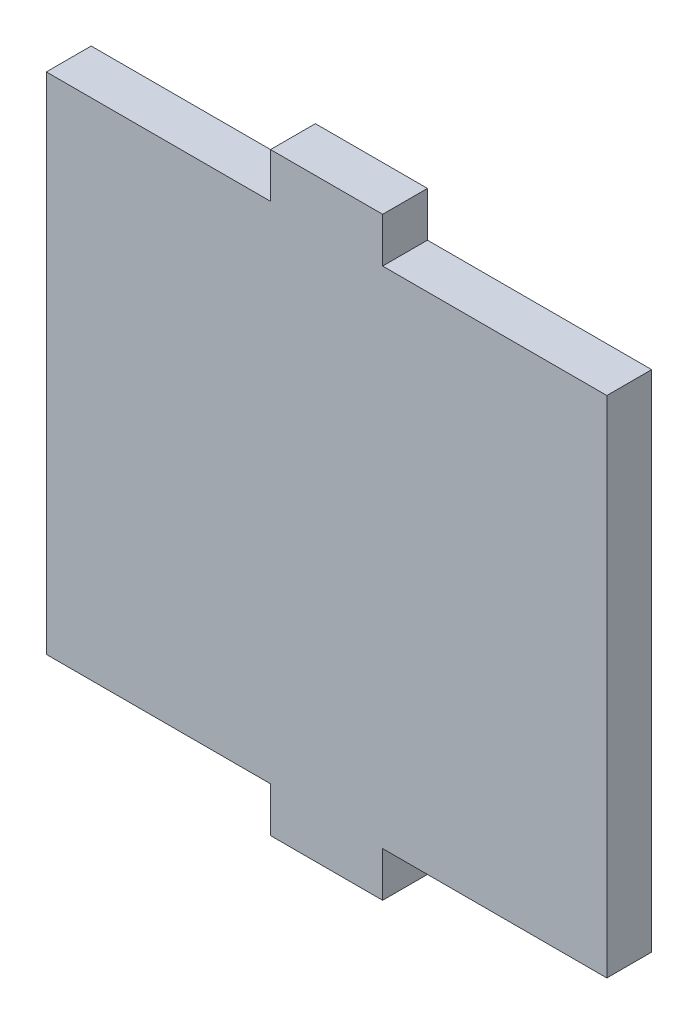
ISO-10303-21;
HEADER;
FILE_DESCRIPTION(('STEP AP214'),'2;1');
FILE_NAME('part.step','',(''),(''),'','','');
FILE_SCHEMA(('AUTOMOTIVE_DESIGN { 1 0 10303 214 1 1 1 1 }'));
ENDSEC;
DATA;
#1=APPLICATION_CONTEXT('core data for automotive mechanical design processes');
#2=APPLICATION_PROTOCOL_DEFINITION('international standard','automotive_design',2000,#1);
#3=PRODUCT_CONTEXT('',#1,'mechanical');
#4=PRODUCT('Part','Part','',(#3));
#5=PRODUCT_RELATED_PRODUCT_CATEGORY('part','',(#4));
#6=PRODUCT_DEFINITION_FORMATION('','',#4);
#7=PRODUCT_DEFINITION_CONTEXT('part definition',#1,'design');
#8=PRODUCT_DEFINITION('design','',#6,#7);
#9=PRODUCT_DEFINITION_SHAPE('','',#8);
#10=(LENGTH_UNIT() NAMED_UNIT(*) SI_UNIT(.MILLI.,.METRE.));
#11=(NAMED_UNIT(*) PLANE_ANGLE_UNIT() SI_UNIT($,.RADIAN.));
#12=(NAMED_UNIT(*) SI_UNIT($,.STERADIAN.) SOLID_ANGLE_UNIT());
#13=UNCERTAINTY_MEASURE_WITH_UNIT(LENGTH_MEASURE(1.E-05),#10,'distance_accuracy_value','');
#14=(GEOMETRIC_REPRESENTATION_CONTEXT(3) GLOBAL_UNCERTAINTY_ASSIGNED_CONTEXT((#13)) GLOBAL_UNIT_ASSIGNED_CONTEXT((#10,
#11,#12)) REPRESENTATION_CONTEXT('',''));
#15=CARTESIAN_POINT('',(0.,0.,0.));
#16=DIRECTION('',(0.,0.,1.));
#17=DIRECTION('',(1.,0.,0.));
#18=AXIS2_PLACEMENT_3D('',#15,#16,#17);
#19=CARTESIAN_POINT('',(0.,0.,4.));
#20=DIRECTION('',(0.,-1.,0.));
#21=DIRECTION('',(0.,0.,-1.));
#22=AXIS2_PLACEMENT_3D('',#19,#20,#21);
#23=PLANE('',#22);
#24=DIRECTION('',(-1.,0.,0.));
#25=VECTOR('',#24,1.);
#26=CARTESIAN_POINT('',(0.,0.,0.));
#27=LINE('',#26,#25);
#28=CARTESIAN_POINT('',(20.,0.,0.));
#29=VERTEX_POINT('',#28);
#30=CARTESIAN_POINT('',(0.,0.,0.));
#31=VERTEX_POINT('',#30);
#32=EDGE_CURVE('E164',#29,#31,#27,.T.);
#33=ORIENTED_EDGE('',*,*,#32,.T.);
#34=DIRECTION('',(0.,0.,-1.));
#35=VECTOR('',#34,1.);
#36=CARTESIAN_POINT('',(0.,0.,4.));
#37=LINE('',#36,#35);
#38=CARTESIAN_POINT('',(0.,0.,4.));
#39=VERTEX_POINT('',#38);
#40=EDGE_CURVE('E11',#39,#31,#37,.T.);
#41=ORIENTED_EDGE('',*,*,#40,.F.);
#42=DIRECTION('',(-1.,0.,0.));
#43=VECTOR('',#42,1.);
#44=CARTESIAN_POINT('',(0.,0.,4.));
#45=LINE('',#44,#43);
#46=CARTESIAN_POINT('',(20.,0.,4.));
#47=VERTEX_POINT('',#46);
#48=EDGE_CURVE('E198',#47,#39,#45,.T.);
#49=ORIENTED_EDGE('',*,*,#48,.F.);
#50=DIRECTION('',(0.,0.,-1.));
#51=VECTOR('',#50,1.);
#52=CARTESIAN_POINT('',(20.,0.,4.));
#53=LINE('',#52,#51);
#54=EDGE_CURVE('E160',#47,#29,#53,.T.);
#55=ORIENTED_EDGE('',*,*,#54,.T.);
#56=EDGE_LOOP('',(#33,#41,#49,#55));
#57=FACE_BOUND('',#56,.T.);
#58=ADVANCED_FACE('F39',(#57),#23,.F.);
#59=CARTESIAN_POINT('',(0.,-45.,4.));
#60=DIRECTION('',(1.,0.,0.));
#61=DIRECTION('',(0.,0.,-1.));
#62=AXIS2_PLACEMENT_3D('',#59,#60,#61);
#63=PLANE('',#62);
#64=DIRECTION('',(0.,-1.,0.));
#65=VECTOR('',#64,1.);
#66=CARTESIAN_POINT('',(0.,-45.,0.));
#67=LINE('',#66,#65);
#68=CARTESIAN_POINT('',(0.,-45.,0.));
#69=VERTEX_POINT('',#68);
#70=EDGE_CURVE('E168',#31,#69,#67,.T.);
#71=ORIENTED_EDGE('',*,*,#70,.T.);
#72=DIRECTION('',(0.,0.,-1.));
#73=VECTOR('',#72,1.);
#74=CARTESIAN_POINT('',(0.,-45.,4.));
#75=LINE('',#74,#73);
#76=CARTESIAN_POINT('',(0.,-45.,4.));
#77=VERTEX_POINT('',#76);
#78=EDGE_CURVE('E48',#77,#69,#75,.T.);
#79=ORIENTED_EDGE('',*,*,#78,.F.);
#80=DIRECTION('',(0.,-1.,0.));
#81=VECTOR('',#80,1.);
#82=CARTESIAN_POINT('',(0.,-45.,4.));
#83=LINE('',#82,#81);
#84=EDGE_CURVE('E111',#39,#77,#83,.T.);
#85=ORIENTED_EDGE('',*,*,#84,.F.);
#86=ORIENTED_EDGE('',*,*,#40,.T.);
#87=EDGE_LOOP('',(#71,#79,#85,#86));
#88=FACE_BOUND('',#87,.T.);
#89=ADVANCED_FACE('F292',(#88),#63,.F.);
#90=CARTESIAN_POINT('',(20.,-45.,4.));
#91=DIRECTION('',(0.,1.,0.));
#92=DIRECTION('',(0.,0.,1.));
#93=AXIS2_PLACEMENT_3D('',#90,#91,#92);
#94=PLANE('',#93);
#95=DIRECTION('',(1.,0.,0.));
#96=VECTOR('',#95,1.);
#97=CARTESIAN_POINT('',(20.,-45.,0.));
#98=LINE('',#97,#96);
#99=CARTESIAN_POINT('',(20.,-45.,0.));
#100=VERTEX_POINT('',#99);
#101=EDGE_CURVE('E171',#69,#100,#98,.T.);
#102=ORIENTED_EDGE('',*,*,#101,.T.);
#103=DIRECTION('',(0.,0.,-1.));
#104=VECTOR('',#103,1.);
#105=CARTESIAN_POINT('',(20.,-45.,4.));
#106=LINE('',#105,#104);
#107=CARTESIAN_POINT('',(20.,-45.,4.));
#108=VERTEX_POINT('',#107);
#109=EDGE_CURVE('E225',#108,#100,#106,.T.);
#110=ORIENTED_EDGE('',*,*,#109,.F.);
#111=DIRECTION('',(1.,0.,0.));
#112=VECTOR('',#111,1.);
#113=CARTESIAN_POINT('',(20.,-45.,4.));
#114=LINE('',#113,#112);
#115=EDGE_CURVE('E235',#77,#108,#114,.T.);
#116=ORIENTED_EDGE('',*,*,#115,.F.);
#117=ORIENTED_EDGE('',*,*,#78,.T.);
#118=EDGE_LOOP('',(#102,#110,#116,#117));
#119=FACE_BOUND('',#118,.T.);
#120=ADVANCED_FACE('F233',(#119),#94,.F.);
#121=CARTESIAN_POINT('',(20.,-49.,4.));
#122=DIRECTION('',(1.,0.,0.));
#123=DIRECTION('',(0.,0.,-1.));
#124=AXIS2_PLACEMENT_3D('',#121,#122,#123);
#125=PLANE('',#124);
#126=DIRECTION('',(0.,-1.,0.));
#127=VECTOR('',#126,1.);
#128=CARTESIAN_POINT('',(20.,-49.,0.));
#129=LINE('',#128,#127);
#130=CARTESIAN_POINT('',(20.,-49.,0.));
#131=VERTEX_POINT('',#130);
#132=EDGE_CURVE('E174',#100,#131,#129,.T.);
#133=ORIENTED_EDGE('',*,*,#132,.T.);
#134=DIRECTION('',(0.,0.,-1.));
#135=VECTOR('',#134,1.);
#136=CARTESIAN_POINT('',(20.,-49.,4.));
#137=LINE('',#136,#135);
#138=CARTESIAN_POINT('',(20.,-49.,4.));
#139=VERTEX_POINT('',#138);
#140=EDGE_CURVE('E221',#139,#131,#137,.T.);
#141=ORIENTED_EDGE('',*,*,#140,.F.);
#142=DIRECTION('',(0.,-1.,0.));
#143=VECTOR('',#142,1.);
#144=CARTESIAN_POINT('',(20.,-49.,4.));
#145=LINE('',#144,#143);
#146=EDGE_CURVE('E254',#108,#139,#145,.T.);
#147=ORIENTED_EDGE('',*,*,#146,.F.);
#148=ORIENTED_EDGE('',*,*,#109,.T.);
#149=EDGE_LOOP('',(#133,#141,#147,#148));
#150=FACE_BOUND('',#149,.T.);
#151=ADVANCED_FACE('F244',(#150),#125,.F.);
#152=CARTESIAN_POINT('',(30.,-49.,4.));
#153=DIRECTION('',(0.,1.,0.));
#154=DIRECTION('',(0.,0.,1.));
#155=AXIS2_PLACEMENT_3D('',#152,#153,#154);
#156=PLANE('',#155);
#157=DIRECTION('',(1.,0.,0.));
#158=VECTOR('',#157,1.);
#159=CARTESIAN_POINT('',(30.,-49.,0.));
#160=LINE('',#159,#158);
#161=CARTESIAN_POINT('',(30.,-49.,0.));
#162=VERTEX_POINT('',#161);
#163=EDGE_CURVE('E177',#131,#162,#160,.T.);
#164=ORIENTED_EDGE('',*,*,#163,.T.);
#165=DIRECTION('',(0.,0.,-1.));
#166=VECTOR('',#165,1.);
#167=CARTESIAN_POINT('',(30.,-49.,4.));
#168=LINE('',#167,#166);
#169=CARTESIAN_POINT('',(30.,-49.,4.));
#170=VERTEX_POINT('',#169);
#171=EDGE_CURVE('E217',#170,#162,#168,.T.);
#172=ORIENTED_EDGE('',*,*,#171,.F.);
#173=DIRECTION('',(1.,0.,0.));
#174=VECTOR('',#173,1.);
#175=CARTESIAN_POINT('',(30.,-49.,4.));
#176=LINE('',#175,#174);
#177=EDGE_CURVE('E250',#139,#170,#176,.T.);
#178=ORIENTED_EDGE('',*,*,#177,.F.);
#179=ORIENTED_EDGE('',*,*,#140,.T.);
#180=EDGE_LOOP('',(#164,#172,#178,#179));
#181=FACE_BOUND('',#180,.T.);
#182=ADVANCED_FACE('F248',(#181),#156,.F.);
#183=CARTESIAN_POINT('',(30.,-45.,4.));
#184=DIRECTION('',(-1.,0.,0.));
#185=DIRECTION('',(0.,0.,1.));
#186=AXIS2_PLACEMENT_3D('',#183,#184,#185);
#187=PLANE('',#186);
#188=DIRECTION('',(0.,1.,0.));
#189=VECTOR('',#188,1.);
#190=CARTESIAN_POINT('',(30.,-45.,0.));
#191=LINE('',#190,#189);
#192=CARTESIAN_POINT('',(30.,-45.,0.));
#193=VERTEX_POINT('',#192);
#194=EDGE_CURVE('E180',#162,#193,#191,.T.);
#195=ORIENTED_EDGE('',*,*,#194,.T.);
#196=DIRECTION('',(0.,0.,-1.));
#197=VECTOR('',#196,1.);
#198=CARTESIAN_POINT('',(30.,-45.,4.));
#199=LINE('',#198,#197);
#200=CARTESIAN_POINT('',(30.,-45.,4.));
#201=VERTEX_POINT('',#200);
#202=EDGE_CURVE('E213',#201,#193,#199,.T.);
#203=ORIENTED_EDGE('',*,*,#202,.F.);
#204=DIRECTION('',(0.,1.,0.));
#205=VECTOR('',#204,1.);
#206=CARTESIAN_POINT('',(30.,-45.,4.));
#207=LINE('',#206,#205);
#208=EDGE_CURVE('E253',#170,#201,#207,.T.);
#209=ORIENTED_EDGE('',*,*,#208,.F.);
#210=ORIENTED_EDGE('',*,*,#171,.T.);
#211=EDGE_LOOP('',(#195,#203,#209,#210));
#212=FACE_BOUND('',#211,.T.);
#213=ADVANCED_FACE('F305',(#212),#187,.F.);
#214=CARTESIAN_POINT('',(50.,-45.,4.));
#215=DIRECTION('',(0.,1.,0.));
#216=DIRECTION('',(0.,0.,1.));
#217=AXIS2_PLACEMENT_3D('',#214,#215,#216);
#218=PLANE('',#217);
#219=DIRECTION('',(1.,0.,0.));
#220=VECTOR('',#219,1.);
#221=CARTESIAN_POINT('',(50.,-45.,0.));
#222=LINE('',#221,#220);
#223=CARTESIAN_POINT('',(50.,-45.,0.));
#224=VERTEX_POINT('',#223);
#225=EDGE_CURVE('E183',#193,#224,#222,.T.);
#226=ORIENTED_EDGE('',*,*,#225,.T.);
#227=DIRECTION('',(0.,0.,-1.));
#228=VECTOR('',#227,1.);
#229=CARTESIAN_POINT('',(50.,-45.,4.));
#230=LINE('',#229,#228);
#231=CARTESIAN_POINT('',(50.,-45.,4.));
#232=VERTEX_POINT('',#231);
#233=EDGE_CURVE('E209',#232,#224,#230,.T.);
#234=ORIENTED_EDGE('',*,*,#233,.F.);
#235=DIRECTION('',(1.,0.,0.));
#236=VECTOR('',#235,1.);
#237=CARTESIAN_POINT('',(50.,-45.,4.));
#238=LINE('',#237,#236);
#239=EDGE_CURVE('E258',#201,#232,#238,.T.);
#240=ORIENTED_EDGE('',*,*,#239,.F.);
#241=ORIENTED_EDGE('',*,*,#202,.T.);
#242=EDGE_LOOP('',(#226,#234,#240,#241));
#243=FACE_BOUND('',#242,.T.);
#244=ADVANCED_FACE('F308',(#243),#218,.F.);
#245=CARTESIAN_POINT('',(50.,0.,4.));
#246=DIRECTION('',(-1.,0.,0.));
#247=DIRECTION('',(0.,-1.,0.));
#248=AXIS2_PLACEMENT_3D('',#245,#246,#247);
#249=PLANE('',#248);
#250=DIRECTION('',(0.,1.,0.));
#251=VECTOR('',#250,1.);
#252=CARTESIAN_POINT('',(50.,0.,0.));
#253=LINE('',#252,#251);
#254=CARTESIAN_POINT('',(50.,0.,0.));
#255=VERTEX_POINT('',#254);
#256=EDGE_CURVE('E186',#224,#255,#253,.T.);
#257=ORIENTED_EDGE('',*,*,#256,.T.);
#258=DIRECTION('',(0.,0.,-1.));
#259=VECTOR('',#258,1.);
#260=CARTESIAN_POINT('',(50.,0.,4.));
#261=LINE('',#260,#259);
#262=CARTESIAN_POINT('',(50.,0.,4.));
#263=VERTEX_POINT('',#262);
#264=EDGE_CURVE('E205',#263,#255,#261,.T.);
#265=ORIENTED_EDGE('',*,*,#264,.F.);
#266=DIRECTION('',(0.,1.,0.));
#267=VECTOR('',#266,1.);
#268=CARTESIAN_POINT('',(50.,0.,4.));
#269=LINE('',#268,#267);
#270=EDGE_CURVE('E265',#232,#263,#269,.T.);
#271=ORIENTED_EDGE('',*,*,#270,.F.);
#272=ORIENTED_EDGE('',*,*,#233,.T.);
#273=EDGE_LOOP('',(#257,#265,#271,#272));
#274=FACE_BOUND('',#273,.T.);
#275=ADVANCED_FACE('F273',(#274),#249,.F.);
#276=CARTESIAN_POINT('',(30.,0.,4.));
#277=DIRECTION('',(0.,-1.,0.));
#278=DIRECTION('',(0.,0.,-1.));
#279=AXIS2_PLACEMENT_3D('',#276,#277,#278);
#280=PLANE('',#279);
#281=DIRECTION('',(-1.,0.,0.));
#282=VECTOR('',#281,1.);
#283=CARTESIAN_POINT('',(30.,0.,0.));
#284=LINE('',#283,#282);
#285=CARTESIAN_POINT('',(30.,0.,0.));
#286=VERTEX_POINT('',#285);
#287=EDGE_CURVE('E189',#255,#286,#284,.T.);
#288=ORIENTED_EDGE('',*,*,#287,.T.);
#289=DIRECTION('',(0.,0.,-1.));
#290=VECTOR('',#289,1.);
#291=CARTESIAN_POINT('',(30.,0.,4.));
#292=LINE('',#291,#290);
#293=CARTESIAN_POINT('',(30.,0.,4.));
#294=VERTEX_POINT('',#293);
#295=EDGE_CURVE('E153',#294,#286,#292,.T.);
#296=ORIENTED_EDGE('',*,*,#295,.F.);
#297=DIRECTION('',(-1.,0.,0.));
#298=VECTOR('',#297,1.);
#299=CARTESIAN_POINT('',(30.,0.,4.));
#300=LINE('',#299,#298);
#301=EDGE_CURVE('E142',#263,#294,#300,.T.);
#302=ORIENTED_EDGE('',*,*,#301,.F.);
#303=ORIENTED_EDGE('',*,*,#264,.T.);
#304=EDGE_LOOP('',(#288,#296,#302,#303));
#305=FACE_BOUND('',#304,.T.);
#306=ADVANCED_FACE('F277',(#305),#280,.F.);
#307=CARTESIAN_POINT('',(30.,4.,4.));
#308=DIRECTION('',(-1.,0.,0.));
#309=DIRECTION('',(0.,0.,1.));
#310=AXIS2_PLACEMENT_3D('',#307,#308,#309);
#311=PLANE('',#310);
#312=DIRECTION('',(0.,1.,0.));
#313=VECTOR('',#312,1.);
#314=CARTESIAN_POINT('',(30.,4.,0.));
#315=LINE('',#314,#313);
#316=CARTESIAN_POINT('',(30.,4.,0.));
#317=VERTEX_POINT('',#316);
#318=EDGE_CURVE('E151',#286,#317,#315,.T.);
#319=ORIENTED_EDGE('',*,*,#318,.T.);
#320=DIRECTION('',(0.,0.,-1.));
#321=VECTOR('',#320,1.);
#322=CARTESIAN_POINT('',(30.,4.,4.));
#323=LINE('',#322,#321);
#324=CARTESIAN_POINT('',(30.,4.,4.));
#325=VERTEX_POINT('',#324);
#326=EDGE_CURVE('E148',#325,#317,#323,.T.);
#327=ORIENTED_EDGE('',*,*,#326,.F.);
#328=DIRECTION('',(0.,1.,0.));
#329=VECTOR('',#328,1.);
#330=CARTESIAN_POINT('',(30.,4.,4.));
#331=LINE('',#330,#329);
#332=EDGE_CURVE('E136',#294,#325,#331,.T.);
#333=ORIENTED_EDGE('',*,*,#332,.F.);
#334=ORIENTED_EDGE('',*,*,#295,.T.);
#335=EDGE_LOOP('',(#319,#327,#333,#334));
#336=FACE_BOUND('',#335,.T.);
#337=ADVANCED_FACE('F149',(#336),#311,.F.);
#338=CARTESIAN_POINT('',(20.,4.,4.));
#339=DIRECTION('',(0.,-1.,0.));
#340=DIRECTION('',(0.,0.,-1.));
#341=AXIS2_PLACEMENT_3D('',#338,#339,#340);
#342=PLANE('',#341);
#343=DIRECTION('',(-1.,0.,0.));
#344=VECTOR('',#343,1.);
#345=CARTESIAN_POINT('',(20.,4.,0.));
#346=LINE('',#345,#344);
#347=CARTESIAN_POINT('',(20.,4.,0.));
#348=VERTEX_POINT('',#347);
#349=EDGE_CURVE('E97',#317,#348,#346,.T.);
#350=ORIENTED_EDGE('',*,*,#349,.T.);
#351=DIRECTION('',(0.,0.,-1.));
#352=VECTOR('',#351,1.);
#353=CARTESIAN_POINT('',(20.,4.,4.));
#354=LINE('',#353,#352);
#355=CARTESIAN_POINT('',(20.,4.,4.));
#356=VERTEX_POINT('',#355);
#357=EDGE_CURVE('E154',#356,#348,#354,.T.);
#358=ORIENTED_EDGE('',*,*,#357,.F.);
#359=DIRECTION('',(-1.,0.,0.));
#360=VECTOR('',#359,1.);
#361=CARTESIAN_POINT('',(20.,4.,4.));
#362=LINE('',#361,#360);
#363=EDGE_CURVE('E140',#325,#356,#362,.T.);
#364=ORIENTED_EDGE('',*,*,#363,.F.);
#365=ORIENTED_EDGE('',*,*,#326,.T.);
#366=EDGE_LOOP('',(#350,#358,#364,#365));
#367=FACE_BOUND('',#366,.T.);
#368=ADVANCED_FACE('F156',(#367),#342,.F.);
#369=CARTESIAN_POINT('',(20.,0.,4.));
#370=DIRECTION('',(1.,0.,0.));
#371=DIRECTION('',(0.,0.,-1.));
#372=AXIS2_PLACEMENT_3D('',#369,#370,#371);
#373=PLANE('',#372);
#374=DIRECTION('',(0.,-1.,0.));
#375=VECTOR('',#374,1.);
#376=CARTESIAN_POINT('',(20.,0.,0.));
#377=LINE('',#376,#375);
#378=EDGE_CURVE('E103',#348,#29,#377,.T.);
#379=ORIENTED_EDGE('',*,*,#378,.T.);
#380=ORIENTED_EDGE('',*,*,#54,.F.);
#381=DIRECTION('',(0.,-1.,0.));
#382=VECTOR('',#381,1.);
#383=CARTESIAN_POINT('',(20.,0.,4.));
#384=LINE('',#383,#382);
#385=EDGE_CURVE('E56',#356,#47,#384,.T.);
#386=ORIENTED_EDGE('',*,*,#385,.F.);
#387=ORIENTED_EDGE('',*,*,#357,.T.);
#388=EDGE_LOOP('',(#379,#380,#386,#387));
#389=FACE_BOUND('',#388,.T.);
#390=ADVANCED_FACE('F281',(#389),#373,.F.);
#391=CARTESIAN_POINT('',(0.,0.,4.));
#392=DIRECTION('',(0.,0.,1.));
#393=DIRECTION('',(1.,0.,0.));
#394=AXIS2_PLACEMENT_3D('',#391,#392,#393);
#395=PLANE('',#394);
#396=ORIENTED_EDGE('',*,*,#48,.T.);
#397=ORIENTED_EDGE('',*,*,#84,.T.);
#398=ORIENTED_EDGE('',*,*,#115,.T.);
#399=ORIENTED_EDGE('',*,*,#146,.T.);
#400=ORIENTED_EDGE('',*,*,#177,.T.);
#401=ORIENTED_EDGE('',*,*,#208,.T.);
#402=ORIENTED_EDGE('',*,*,#239,.T.);
#403=ORIENTED_EDGE('',*,*,#270,.T.);
#404=ORIENTED_EDGE('',*,*,#301,.T.);
#405=ORIENTED_EDGE('',*,*,#332,.T.);
#406=ORIENTED_EDGE('',*,*,#363,.T.);
#407=ORIENTED_EDGE('',*,*,#385,.T.);
#408=EDGE_LOOP('',(#396,#397,#398,#399,#400,#401,#402,#403,#404,#405,#406,#407));
#409=FACE_BOUND('',#408,.T.);
#410=ADVANCED_FACE('F138',(#409),#395,.T.);
#411=CARTESIAN_POINT('',(0.,0.,0.));
#412=DIRECTION('',(0.,0.,1.));
#413=DIRECTION('',(1.,0.,0.));
#414=AXIS2_PLACEMENT_3D('',#411,#412,#413);
#415=PLANE('',#414);
#416=ORIENTED_EDGE('',*,*,#32,.F.);
#417=ORIENTED_EDGE('',*,*,#378,.F.);
#418=ORIENTED_EDGE('',*,*,#349,.F.);
#419=ORIENTED_EDGE('',*,*,#318,.F.);
#420=ORIENTED_EDGE('',*,*,#287,.F.);
#421=ORIENTED_EDGE('',*,*,#256,.F.);
#422=ORIENTED_EDGE('',*,*,#225,.F.);
#423=ORIENTED_EDGE('',*,*,#194,.F.);
#424=ORIENTED_EDGE('',*,*,#163,.F.);
#425=ORIENTED_EDGE('',*,*,#132,.F.);
#426=ORIENTED_EDGE('',*,*,#101,.F.);
#427=ORIENTED_EDGE('',*,*,#70,.F.);
#428=EDGE_LOOP('',(#416,#417,#418,#419,#420,#421,#422,#423,#424,#425,#426,#427));
#429=FACE_BOUND('',#428,.T.);
#430=ADVANCED_FACE('F239',(#429),#415,.F.);
#431=CLOSED_SHELL('',(#58,#89,#120,#151,#182,#213,#244,#275,#306,#337,#368,#390,#410,#430));
#432=MANIFOLD_SOLID_BREP('B2',#431);
#433=ADVANCED_BREP_SHAPE_REPRESENTATION('',(#18,#432),#14);
#434=SHAPE_DEFINITION_REPRESENTATION(#9,#433);
ENDSEC;
END-ISO-10303-21;
